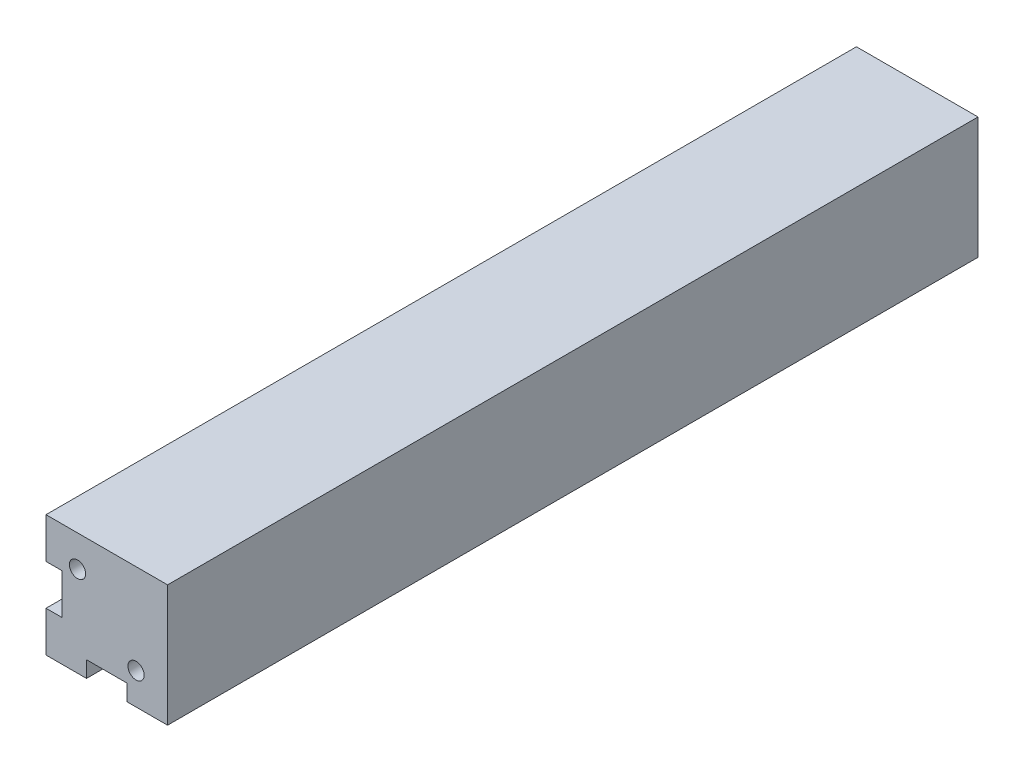
ISO-10303-21;
HEADER;
FILE_DESCRIPTION(('STEP AP214'),'2;1');
FILE_NAME('part.step','',(''),(''),'','','');
FILE_SCHEMA(('AUTOMOTIVE_DESIGN { 1 0 10303 214 1 1 1 1 }'));
ENDSEC;
DATA;
#1=APPLICATION_CONTEXT('core data for automotive mechanical design processes');
#2=APPLICATION_PROTOCOL_DEFINITION('international standard','automotive_design',2000,#1);
#3=PRODUCT_CONTEXT('',#1,'mechanical');
#4=PRODUCT('Part','Part','',(#3));
#5=PRODUCT_RELATED_PRODUCT_CATEGORY('part','',(#4));
#6=PRODUCT_DEFINITION_FORMATION('','',#4);
#7=PRODUCT_DEFINITION_CONTEXT('part definition',#1,'design');
#8=PRODUCT_DEFINITION('design','',#6,#7);
#9=PRODUCT_DEFINITION_SHAPE('','',#8);
#10=(LENGTH_UNIT() NAMED_UNIT(*) SI_UNIT(.MILLI.,.METRE.));
#11=(NAMED_UNIT(*) PLANE_ANGLE_UNIT() SI_UNIT($,.RADIAN.));
#12=(NAMED_UNIT(*) SI_UNIT($,.STERADIAN.) SOLID_ANGLE_UNIT());
#13=UNCERTAINTY_MEASURE_WITH_UNIT(LENGTH_MEASURE(1.E-05),#10,'distance_accuracy_value','');
#14=(GEOMETRIC_REPRESENTATION_CONTEXT(3) GLOBAL_UNCERTAINTY_ASSIGNED_CONTEXT((#13)) GLOBAL_UNIT_ASSIGNED_CONTEXT((#10,
#11,#12)) REPRESENTATION_CONTEXT('',''));
#15=CARTESIAN_POINT('',(0.,0.,0.));
#16=DIRECTION('',(0.,0.,1.));
#17=DIRECTION('',(1.,0.,0.));
#18=AXIS2_PLACEMENT_3D('',#15,#16,#17);
#19=CARTESIAN_POINT('',(-15.,-15.,200.));
#20=DIRECTION('',(1.,0.,0.));
#21=DIRECTION('',(0.,0.,-1.));
#22=AXIS2_PLACEMENT_3D('',#19,#20,#21);
#23=PLANE('',#22);
#24=DIRECTION('',(0.,-1.,0.));
#25=VECTOR('',#24,1.);
#26=CARTESIAN_POINT('',(-15.,-15.,200.));
#27=LINE('',#26,#25);
#28=CARTESIAN_POINT('',(-15.,-5.,200.));
#29=VERTEX_POINT('',#28);
#30=CARTESIAN_POINT('',(-15.,-15.,200.));
#31=VERTEX_POINT('',#30);
#32=EDGE_CURVE('E240',#29,#31,#27,.T.);
#33=ORIENTED_EDGE('',*,*,#32,.F.);
#34=DIRECTION('',(0.,0.,-1.));
#35=VECTOR('',#34,1.);
#36=CARTESIAN_POINT('',(-15.,-5.,200.));
#37=LINE('',#36,#35);
#38=CARTESIAN_POINT('',(-15.,-5.,0.));
#39=VERTEX_POINT('',#38);
#40=EDGE_CURVE('E196',#29,#39,#37,.T.);
#41=ORIENTED_EDGE('',*,*,#40,.T.);
#42=DIRECTION('',(0.,-1.,0.));
#43=VECTOR('',#42,1.);
#44=CARTESIAN_POINT('',(-15.,-15.,0.));
#45=LINE('',#44,#43);
#46=CARTESIAN_POINT('',(-15.,-15.,0.));
#47=VERTEX_POINT('',#46);
#48=EDGE_CURVE('E255',#39,#47,#45,.T.);
#49=ORIENTED_EDGE('',*,*,#48,.T.);
#50=DIRECTION('',(0.,0.,-1.));
#51=VECTOR('',#50,1.);
#52=CARTESIAN_POINT('',(-15.,-15.,200.));
#53=LINE('',#52,#51);
#54=EDGE_CURVE('E267',#31,#47,#53,.T.);
#55=ORIENTED_EDGE('',*,*,#54,.F.);
#56=EDGE_LOOP('',(#33,#41,#49,#55));
#57=FACE_BOUND('',#56,.T.);
#58=ADVANCED_FACE('F44',(#57),#23,.F.);
#59=CARTESIAN_POINT('',(-15.,-15.,200.));
#60=DIRECTION('',(0.,1.,0.));
#61=DIRECTION('',(0.,0.,1.));
#62=AXIS2_PLACEMENT_3D('',#59,#60,#61);
#63=PLANE('',#62);
#64=DIRECTION('',(1.,0.,0.));
#65=VECTOR('',#64,1.);
#66=CARTESIAN_POINT('',(-15.,-15.,0.));
#67=LINE('',#66,#65);
#68=CARTESIAN_POINT('',(-5.,-15.,0.));
#69=VERTEX_POINT('',#68);
#70=EDGE_CURVE('E237',#47,#69,#67,.T.);
#71=ORIENTED_EDGE('',*,*,#70,.T.);
#72=DIRECTION('',(0.,0.,1.));
#73=VECTOR('',#72,1.);
#74=CARTESIAN_POINT('',(-5.,-15.,200.));
#75=LINE('',#74,#73);
#76=CARTESIAN_POINT('',(-5.,-15.,200.));
#77=VERTEX_POINT('',#76);
#78=EDGE_CURVE('E204',#69,#77,#75,.T.);
#79=ORIENTED_EDGE('',*,*,#78,.T.);
#80=DIRECTION('',(1.,0.,0.));
#81=VECTOR('',#80,1.);
#82=CARTESIAN_POINT('',(-15.,-15.,200.));
#83=LINE('',#82,#81);
#84=EDGE_CURVE('E154',#31,#77,#83,.T.);
#85=ORIENTED_EDGE('',*,*,#84,.F.);
#86=ORIENTED_EDGE('',*,*,#54,.T.);
#87=EDGE_LOOP('',(#71,#79,#85,#86));
#88=FACE_BOUND('',#87,.T.);
#89=ADVANCED_FACE('F318',(#88),#63,.F.);
#90=CARTESIAN_POINT('',(15.,-15.,200.));
#91=DIRECTION('',(-1.,0.,0.));
#92=DIRECTION('',(0.,0.,1.));
#93=AXIS2_PLACEMENT_3D('',#90,#91,#92);
#94=PLANE('',#93);
#95=DIRECTION('',(0.,1.,0.));
#96=VECTOR('',#95,1.);
#97=CARTESIAN_POINT('',(15.,-15.,0.));
#98=LINE('',#97,#96);
#99=CARTESIAN_POINT('',(15.,-15.,0.));
#100=VERTEX_POINT('',#99);
#101=CARTESIAN_POINT('',(15.,15.,0.));
#102=VERTEX_POINT('',#101);
#103=EDGE_CURVE('E220',#100,#102,#98,.T.);
#104=ORIENTED_EDGE('',*,*,#103,.T.);
#105=DIRECTION('',(0.,0.,-1.));
#106=VECTOR('',#105,1.);
#107=CARTESIAN_POINT('',(15.,15.,200.));
#108=LINE('',#107,#106);
#109=CARTESIAN_POINT('',(15.,15.,200.));
#110=VERTEX_POINT('',#109);
#111=EDGE_CURVE('E275',#110,#102,#108,.T.);
#112=ORIENTED_EDGE('',*,*,#111,.F.);
#113=DIRECTION('',(0.,1.,0.));
#114=VECTOR('',#113,1.);
#115=CARTESIAN_POINT('',(15.,-15.,200.));
#116=LINE('',#115,#114);
#117=CARTESIAN_POINT('',(15.,-15.,200.));
#118=VERTEX_POINT('',#117);
#119=EDGE_CURVE('E232',#118,#110,#116,.T.);
#120=ORIENTED_EDGE('',*,*,#119,.F.);
#121=DIRECTION('',(0.,0.,-1.));
#122=VECTOR('',#121,1.);
#123=CARTESIAN_POINT('',(15.,-15.,200.));
#124=LINE('',#123,#122);
#125=EDGE_CURVE('E248',#118,#100,#124,.T.);
#126=ORIENTED_EDGE('',*,*,#125,.T.);
#127=EDGE_LOOP('',(#104,#112,#120,#126));
#128=FACE_BOUND('',#127,.T.);
#129=ADVANCED_FACE('F46',(#128),#94,.F.);
#130=CARTESIAN_POINT('',(-15.,15.,200.));
#131=DIRECTION('',(0.,-1.,0.));
#132=DIRECTION('',(0.,0.,-1.));
#133=AXIS2_PLACEMENT_3D('',#130,#131,#132);
#134=PLANE('',#133);
#135=DIRECTION('',(-1.,0.,0.));
#136=VECTOR('',#135,1.);
#137=CARTESIAN_POINT('',(-15.,15.,0.));
#138=LINE('',#137,#136);
#139=CARTESIAN_POINT('',(-15.,15.,0.));
#140=VERTEX_POINT('',#139);
#141=EDGE_CURVE('E252',#102,#140,#138,.T.);
#142=ORIENTED_EDGE('',*,*,#141,.T.);
#143=DIRECTION('',(0.,0.,-1.));
#144=VECTOR('',#143,1.);
#145=CARTESIAN_POINT('',(-15.,15.,200.));
#146=LINE('',#145,#144);
#147=CARTESIAN_POINT('',(-15.,15.,200.));
#148=VERTEX_POINT('',#147);
#149=EDGE_CURVE('E271',#148,#140,#146,.T.);
#150=ORIENTED_EDGE('',*,*,#149,.F.);
#151=DIRECTION('',(-1.,0.,0.));
#152=VECTOR('',#151,1.);
#153=CARTESIAN_POINT('',(-15.,15.,200.));
#154=LINE('',#153,#152);
#155=EDGE_CURVE('E236',#110,#148,#154,.T.);
#156=ORIENTED_EDGE('',*,*,#155,.F.);
#157=ORIENTED_EDGE('',*,*,#111,.T.);
#158=EDGE_LOOP('',(#142,#150,#156,#157));
#159=FACE_BOUND('',#158,.T.);
#160=ADVANCED_FACE('F313',(#159),#134,.F.);
#161=CARTESIAN_POINT('',(-15.,5.,0.));
#162=VERTEX_POINT('',#161);
#163=EDGE_CURVE('E256',#140,#162,#45,.T.);
#164=ORIENTED_EDGE('',*,*,#163,.T.);
#165=DIRECTION('',(0.,0.,1.));
#166=VECTOR('',#165,1.);
#167=CARTESIAN_POINT('',(-15.,5.,200.));
#168=LINE('',#167,#166);
#169=CARTESIAN_POINT('',(-15.,5.,200.));
#170=VERTEX_POINT('',#169);
#171=EDGE_CURVE('E67',#162,#170,#168,.T.);
#172=ORIENTED_EDGE('',*,*,#171,.T.);
#173=EDGE_CURVE('E241',#148,#170,#27,.T.);
#174=ORIENTED_EDGE('',*,*,#173,.F.);
#175=ORIENTED_EDGE('',*,*,#149,.T.);
#176=EDGE_LOOP('',(#164,#172,#174,#175));
#177=FACE_BOUND('',#176,.T.);
#178=ADVANCED_FACE('F327',(#177),#23,.F.);
#179=CARTESIAN_POINT('',(5.,-15.,200.));
#180=VERTEX_POINT('',#179);
#181=EDGE_CURVE('E245',#180,#118,#83,.T.);
#182=ORIENTED_EDGE('',*,*,#181,.F.);
#183=DIRECTION('',(0.,0.,-1.));
#184=VECTOR('',#183,1.);
#185=CARTESIAN_POINT('',(5.,-15.,200.));
#186=LINE('',#185,#184);
#187=CARTESIAN_POINT('',(5.,-15.,0.));
#188=VERTEX_POINT('',#187);
#189=EDGE_CURVE('E200',#180,#188,#186,.T.);
#190=ORIENTED_EDGE('',*,*,#189,.T.);
#191=EDGE_CURVE('E260',#188,#100,#67,.T.);
#192=ORIENTED_EDGE('',*,*,#191,.T.);
#193=ORIENTED_EDGE('',*,*,#125,.F.);
#194=EDGE_LOOP('',(#182,#190,#192,#193));
#195=FACE_BOUND('',#194,.T.);
#196=ADVANCED_FACE('F305',(#195),#63,.F.);
#197=CARTESIAN_POINT('',(0.,0.,200.));
#198=DIRECTION('',(0.,0.,-1.));
#199=DIRECTION('',(-1.,0.,0.));
#200=AXIS2_PLACEMENT_3D('',#197,#198,#199);
#201=PLANE('',#200);
#202=ORIENTED_EDGE('',*,*,#84,.T.);
#203=DIRECTION('',(0.,1.,0.));
#204=VECTOR('',#203,1.);
#205=CARTESIAN_POINT('',(-5.,-19.,200.));
#206=LINE('',#205,#204);
#207=CARTESIAN_POINT('',(-5.,-11.,200.));
#208=VERTEX_POINT('',#207);
#209=EDGE_CURVE('E134',#77,#208,#206,.T.);
#210=ORIENTED_EDGE('',*,*,#209,.T.);
#211=DIRECTION('',(1.,0.,0.));
#212=VECTOR('',#211,1.);
#213=CARTESIAN_POINT('',(5.,-11.,200.));
#214=LINE('',#213,#212);
#215=CARTESIAN_POINT('',(5.,-11.,200.));
#216=VERTEX_POINT('',#215);
#217=EDGE_CURVE('E143',#208,#216,#214,.T.);
#218=ORIENTED_EDGE('',*,*,#217,.T.);
#219=DIRECTION('',(0.,-1.,0.));
#220=VECTOR('',#219,1.);
#221=CARTESIAN_POINT('',(5.,-19.,200.));
#222=LINE('',#221,#220);
#223=EDGE_CURVE('E140',#216,#180,#222,.T.);
#224=ORIENTED_EDGE('',*,*,#223,.T.);
#225=ORIENTED_EDGE('',*,*,#181,.T.);
#226=ORIENTED_EDGE('',*,*,#119,.T.);
#227=ORIENTED_EDGE('',*,*,#155,.T.);
#228=ORIENTED_EDGE('',*,*,#173,.T.);
#229=DIRECTION('',(1.,0.,0.));
#230=VECTOR('',#229,1.);
#231=CARTESIAN_POINT('',(-11.,5.,200.));
#232=LINE('',#231,#230);
#233=CARTESIAN_POINT('',(-11.,5.,200.));
#234=VERTEX_POINT('',#233);
#235=EDGE_CURVE('E180',#170,#234,#232,.T.);
#236=ORIENTED_EDGE('',*,*,#235,.T.);
#237=DIRECTION('',(0.,-1.,0.));
#238=VECTOR('',#237,1.);
#239=CARTESIAN_POINT('',(-11.,-5.,200.));
#240=LINE('',#239,#238);
#241=CARTESIAN_POINT('',(-11.,-5.,200.));
#242=VERTEX_POINT('',#241);
#243=EDGE_CURVE('E187',#234,#242,#240,.T.);
#244=ORIENTED_EDGE('',*,*,#243,.T.);
#245=DIRECTION('',(-1.,0.,0.));
#246=VECTOR('',#245,1.);
#247=CARTESIAN_POINT('',(-11.,-5.,200.));
#248=LINE('',#247,#246);
#249=EDGE_CURVE('E173',#242,#29,#248,.T.);
#250=ORIENTED_EDGE('',*,*,#249,.T.);
#251=ORIENTED_EDGE('',*,*,#32,.T.);
#252=EDGE_LOOP('',(#202,#210,#218,#224,#225,#226,#227,#228,#236,#244,#250,#251));
#253=FACE_BOUND('',#252,.T.);
#254=CARTESIAN_POINT('',(-7.22182540694798,7.22182540694798,200.));
#255=DIRECTION('',(0.,0.,1.));
#256=DIRECTION('',(1.,0.,0.));
#257=AXIS2_PLACEMENT_3D('',#254,#255,#256);
#258=CIRCLE('',#257,2.);
#259=CARTESIAN_POINT('',(-5.22182540694798,7.22182540694798,200.));
#260=VERTEX_POINT('',#259);
#261=EDGE_CURVE('E221',#260,#260,#258,.T.);
#262=ORIENTED_EDGE('',*,*,#261,.F.);
#263=EDGE_LOOP('',(#262));
#264=FACE_BOUND('',#263,.T.);
#265=CARTESIAN_POINT('',(7.22182540694797,-7.22182540694799,200.));
#266=DIRECTION('',(0.,0.,1.));
#267=DIRECTION('',(-1.,0.,0.));
#268=AXIS2_PLACEMENT_3D('',#265,#266,#267);
#269=CIRCLE('',#268,2.00000000000001);
#270=CARTESIAN_POINT('',(5.22182540694796,-7.22182540694799,200.));
#271=VERTEX_POINT('',#270);
#272=EDGE_CURVE('E225',#271,#271,#269,.T.);
#273=ORIENTED_EDGE('',*,*,#272,.F.);
#274=EDGE_LOOP('',(#273));
#275=FACE_BOUND('',#274,.T.);
#276=ADVANCED_FACE('F151',(#253,#264,#275),#201,.F.);
#277=CARTESIAN_POINT('',(0.,0.,0.));
#278=DIRECTION('',(0.,0.,-1.));
#279=DIRECTION('',(-1.,0.,0.));
#280=AXIS2_PLACEMENT_3D('',#277,#278,#279);
#281=PLANE('',#280);
#282=DIRECTION('',(0.,1.,0.));
#283=VECTOR('',#282,1.);
#284=CARTESIAN_POINT('',(-5.,0.,0.));
#285=LINE('',#284,#283);
#286=CARTESIAN_POINT('',(-5.,-11.,0.));
#287=VERTEX_POINT('',#286);
#288=EDGE_CURVE('E11',#69,#287,#285,.T.);
#289=ORIENTED_EDGE('',*,*,#288,.F.);
#290=ORIENTED_EDGE('',*,*,#70,.F.);
#291=ORIENTED_EDGE('',*,*,#48,.F.);
#292=DIRECTION('',(-1.,0.,0.));
#293=VECTOR('',#292,1.);
#294=CARTESIAN_POINT('',(-11.,-5.,0.));
#295=LINE('',#294,#293);
#296=CARTESIAN_POINT('',(-11.,-5.,0.));
#297=VERTEX_POINT('',#296);
#298=EDGE_CURVE('E177',#297,#39,#295,.T.);
#299=ORIENTED_EDGE('',*,*,#298,.F.);
#300=DIRECTION('',(0.,-1.,0.));
#301=VECTOR('',#300,1.);
#302=CARTESIAN_POINT('',(-11.,-5.,0.));
#303=LINE('',#302,#301);
#304=CARTESIAN_POINT('',(-11.,5.,0.));
#305=VERTEX_POINT('',#304);
#306=EDGE_CURVE('E165',#305,#297,#303,.T.);
#307=ORIENTED_EDGE('',*,*,#306,.F.);
#308=DIRECTION('',(1.,0.,0.));
#309=VECTOR('',#308,1.);
#310=CARTESIAN_POINT('',(0.,5.,0.));
#311=LINE('',#310,#309);
#312=EDGE_CURVE('E53',#162,#305,#311,.T.);
#313=ORIENTED_EDGE('',*,*,#312,.F.);
#314=ORIENTED_EDGE('',*,*,#163,.F.);
#315=ORIENTED_EDGE('',*,*,#141,.F.);
#316=ORIENTED_EDGE('',*,*,#103,.F.);
#317=ORIENTED_EDGE('',*,*,#191,.F.);
#318=DIRECTION('',(0.,-1.,0.));
#319=VECTOR('',#318,1.);
#320=CARTESIAN_POINT('',(5.,-19.,0.));
#321=LINE('',#320,#319);
#322=CARTESIAN_POINT('',(5.,-11.,0.));
#323=VERTEX_POINT('',#322);
#324=EDGE_CURVE('E156',#323,#188,#321,.T.);
#325=ORIENTED_EDGE('',*,*,#324,.F.);
#326=DIRECTION('',(1.,0.,0.));
#327=VECTOR('',#326,1.);
#328=CARTESIAN_POINT('',(5.,-11.,0.));
#329=LINE('',#328,#327);
#330=EDGE_CURVE('E159',#287,#323,#329,.T.);
#331=ORIENTED_EDGE('',*,*,#330,.F.);
#332=EDGE_LOOP('',(#289,#290,#291,#299,#307,#313,#314,#315,#316,#317,#325,#331));
#333=FACE_BOUND('',#332,.T.);
#334=CARTESIAN_POINT('',(0.,0.,0.));
#335=DIRECTION('',(0.,0.,-1.));
#336=DIRECTION('',(-1.,0.,0.));
#337=AXIS2_PLACEMENT_3D('',#334,#335,#336);
#338=CIRCLE('',#337,2.);
#339=CARTESIAN_POINT('',(-2.,0.,0.));
#340=VERTEX_POINT('',#339);
#341=EDGE_CURVE('E207',#340,#340,#338,.T.);
#342=ORIENTED_EDGE('',*,*,#341,.F.);
#343=EDGE_LOOP('',(#342));
#344=FACE_BOUND('',#343,.T.);
#345=ADVANCED_FACE('F287',(#333,#344),#281,.T.);
#346=CARTESIAN_POINT('',(7.22182540694797,-7.22182540694799,175.));
#347=DIRECTION('',(0.,0.,1.));
#348=DIRECTION('',(1.,0.,0.));
#349=AXIS2_PLACEMENT_3D('',#346,#347,#348);
#350=CYLINDRICAL_SURFACE('',#349,2.00000000000001);
#351=CARTESIAN_POINT('',(7.22182540694797,-7.22182540694799,175.));
#352=DIRECTION('',(0.,0.,1.));
#353=DIRECTION('',(-1.,0.,0.));
#354=AXIS2_PLACEMENT_3D('',#351,#352,#353);
#355=CIRCLE('',#354,2.00000000000001);
#356=CARTESIAN_POINT('',(5.22182540694796,-7.22182540694799,175.));
#357=VERTEX_POINT('',#356);
#358=EDGE_CURVE('E212',#357,#357,#355,.T.);
#359=ORIENTED_EDGE('',*,*,#358,.F.);
#360=EDGE_LOOP('',(#359));
#361=FACE_BOUND('',#360,.T.);
#362=ORIENTED_EDGE('',*,*,#272,.T.);
#363=EDGE_LOOP('',(#362));
#364=FACE_BOUND('',#363,.T.);
#365=ADVANCED_FACE('F346',(#361,#364),#350,.F.);
#366=CARTESIAN_POINT('',(7.22182540694797,-7.22182540694799,175.));
#367=DIRECTION('',(0.,0.,-1.));
#368=DIRECTION('',(-1.,0.,0.));
#369=AXIS2_PLACEMENT_3D('',#366,#367,#368);
#370=PLANE('',#369);
#371=ORIENTED_EDGE('',*,*,#358,.T.);
#372=EDGE_LOOP('',(#371));
#373=FACE_BOUND('',#372,.T.);
#374=ADVANCED_FACE('F350',(#373),#370,.F.);
#375=CARTESIAN_POINT('',(-7.22182540694798,7.22182540694798,175.));
#376=DIRECTION('',(0.,0.,1.));
#377=DIRECTION('',(1.,0.,0.));
#378=AXIS2_PLACEMENT_3D('',#375,#376,#377);
#379=CYLINDRICAL_SURFACE('',#378,2.);
#380=CARTESIAN_POINT('',(-7.22182540694798,7.22182540694798,175.));
#381=DIRECTION('',(0.,0.,1.));
#382=DIRECTION('',(1.,0.,0.));
#383=AXIS2_PLACEMENT_3D('',#380,#381,#382);
#384=CIRCLE('',#383,2.);
#385=CARTESIAN_POINT('',(-5.22182540694798,7.22182540694798,175.));
#386=VERTEX_POINT('',#385);
#387=EDGE_CURVE('E216',#386,#386,#384,.T.);
#388=ORIENTED_EDGE('',*,*,#387,.F.);
#389=EDGE_LOOP('',(#388));
#390=FACE_BOUND('',#389,.T.);
#391=ORIENTED_EDGE('',*,*,#261,.T.);
#392=EDGE_LOOP('',(#391));
#393=FACE_BOUND('',#392,.T.);
#394=ADVANCED_FACE('F360',(#390,#393),#379,.F.);
#395=CARTESIAN_POINT('',(-7.22182540694798,7.22182540694798,175.));
#396=DIRECTION('',(0.,0.,1.));
#397=DIRECTION('',(1.,0.,0.));
#398=AXIS2_PLACEMENT_3D('',#395,#396,#397);
#399=PLANE('',#398);
#400=ORIENTED_EDGE('',*,*,#387,.T.);
#401=EDGE_LOOP('',(#400));
#402=FACE_BOUND('',#401,.T.);
#403=ADVANCED_FACE('F369',(#402),#399,.T.);
#404=CARTESIAN_POINT('',(0.,0.,25.));
#405=DIRECTION('',(0.,0.,-1.));
#406=DIRECTION('',(-1.,0.,0.));
#407=AXIS2_PLACEMENT_3D('',#404,#405,#406);
#408=CYLINDRICAL_SURFACE('',#407,2.);
#409=CARTESIAN_POINT('',(0.,0.,25.));
#410=DIRECTION('',(0.,0.,-1.));
#411=DIRECTION('',(-1.,0.,0.));
#412=AXIS2_PLACEMENT_3D('',#409,#410,#411);
#413=CIRCLE('',#412,2.);
#414=CARTESIAN_POINT('',(-2.,0.,25.));
#415=VERTEX_POINT('',#414);
#416=EDGE_CURVE('E208',#415,#415,#413,.T.);
#417=ORIENTED_EDGE('',*,*,#416,.F.);
#418=EDGE_LOOP('',(#417));
#419=FACE_BOUND('',#418,.T.);
#420=ORIENTED_EDGE('',*,*,#341,.T.);
#421=EDGE_LOOP('',(#420));
#422=FACE_BOUND('',#421,.T.);
#423=ADVANCED_FACE('F378',(#419,#422),#408,.F.);
#424=CARTESIAN_POINT('',(0.,0.,25.));
#425=DIRECTION('',(0.,0.,-1.));
#426=DIRECTION('',(-1.,0.,0.));
#427=AXIS2_PLACEMENT_3D('',#424,#425,#426);
#428=PLANE('',#427);
#429=ORIENTED_EDGE('',*,*,#416,.T.);
#430=EDGE_LOOP('',(#429));
#431=FACE_BOUND('',#430,.T.);
#432=ADVANCED_FACE('F387',(#431),#428,.T.);
#433=CARTESIAN_POINT('',(-11.,-5.,200.));
#434=DIRECTION('',(0.,-1.,0.));
#435=DIRECTION('',(0.,0.,-1.));
#436=AXIS2_PLACEMENT_3D('',#433,#434,#435);
#437=PLANE('',#436);
#438=ORIENTED_EDGE('',*,*,#249,.F.);
#439=DIRECTION('',(0.,0.,-1.));
#440=VECTOR('',#439,1.);
#441=CARTESIAN_POINT('',(-11.,-5.,200.));
#442=LINE('',#441,#440);
#443=EDGE_CURVE('E174',#242,#297,#442,.T.);
#444=ORIENTED_EDGE('',*,*,#443,.T.);
#445=ORIENTED_EDGE('',*,*,#298,.T.);
#446=ORIENTED_EDGE('',*,*,#40,.F.);
#447=EDGE_LOOP('',(#438,#444,#445,#446));
#448=FACE_BOUND('',#447,.T.);
#449=ADVANCED_FACE('F293',(#448),#437,.F.);
#450=CARTESIAN_POINT('',(-11.,5.,200.));
#451=DIRECTION('',(0.,1.,0.));
#452=DIRECTION('',(0.,0.,1.));
#453=AXIS2_PLACEMENT_3D('',#450,#451,#452);
#454=PLANE('',#453);
#455=ORIENTED_EDGE('',*,*,#312,.T.);
#456=DIRECTION('',(0.,0.,-1.));
#457=VECTOR('',#456,1.);
#458=CARTESIAN_POINT('',(-11.,5.,200.));
#459=LINE('',#458,#457);
#460=EDGE_CURVE('E169',#234,#305,#459,.T.);
#461=ORIENTED_EDGE('',*,*,#460,.F.);
#462=ORIENTED_EDGE('',*,*,#235,.F.);
#463=ORIENTED_EDGE('',*,*,#171,.F.);
#464=EDGE_LOOP('',(#455,#461,#462,#463));
#465=FACE_BOUND('',#464,.T.);
#466=ADVANCED_FACE('F279',(#465),#454,.F.);
#467=CARTESIAN_POINT('',(-11.,-5.,200.));
#468=DIRECTION('',(1.,0.,0.));
#469=DIRECTION('',(0.,0.,-1.));
#470=AXIS2_PLACEMENT_3D('',#467,#468,#469);
#471=PLANE('',#470);
#472=ORIENTED_EDGE('',*,*,#306,.T.);
#473=ORIENTED_EDGE('',*,*,#443,.F.);
#474=ORIENTED_EDGE('',*,*,#243,.F.);
#475=ORIENTED_EDGE('',*,*,#460,.T.);
#476=EDGE_LOOP('',(#472,#473,#474,#475));
#477=FACE_BOUND('',#476,.T.);
#478=ADVANCED_FACE('F285',(#477),#471,.F.);
#479=CARTESIAN_POINT('',(-5.,-19.,200.));
#480=DIRECTION('',(-1.,0.,0.));
#481=DIRECTION('',(0.,0.,1.));
#482=AXIS2_PLACEMENT_3D('',#479,#480,#481);
#483=PLANE('',#482);
#484=ORIENTED_EDGE('',*,*,#288,.T.);
#485=DIRECTION('',(0.,0.,-1.));
#486=VECTOR('',#485,1.);
#487=CARTESIAN_POINT('',(-5.,-11.,200.));
#488=LINE('',#487,#486);
#489=EDGE_CURVE('E60',#208,#287,#488,.T.);
#490=ORIENTED_EDGE('',*,*,#489,.F.);
#491=ORIENTED_EDGE('',*,*,#209,.F.);
#492=ORIENTED_EDGE('',*,*,#78,.F.);
#493=EDGE_LOOP('',(#484,#490,#491,#492));
#494=FACE_BOUND('',#493,.T.);
#495=ADVANCED_FACE('F132',(#494),#483,.F.);
#496=CARTESIAN_POINT('',(5.,-19.,200.));
#497=DIRECTION('',(1.,0.,0.));
#498=DIRECTION('',(0.,0.,-1.));
#499=AXIS2_PLACEMENT_3D('',#496,#497,#498);
#500=PLANE('',#499);
#501=ORIENTED_EDGE('',*,*,#223,.F.);
#502=DIRECTION('',(0.,0.,-1.));
#503=VECTOR('',#502,1.);
#504=CARTESIAN_POINT('',(5.,-11.,200.));
#505=LINE('',#504,#503);
#506=EDGE_CURVE('E139',#216,#323,#505,.T.);
#507=ORIENTED_EDGE('',*,*,#506,.T.);
#508=ORIENTED_EDGE('',*,*,#324,.T.);
#509=ORIENTED_EDGE('',*,*,#189,.F.);
#510=EDGE_LOOP('',(#501,#507,#508,#509));
#511=FACE_BOUND('',#510,.T.);
#512=ADVANCED_FACE('F316',(#511),#500,.F.);
#513=CARTESIAN_POINT('',(5.,-11.,200.));
#514=DIRECTION('',(0.,1.,0.));
#515=DIRECTION('',(0.,0.,1.));
#516=AXIS2_PLACEMENT_3D('',#513,#514,#515);
#517=PLANE('',#516);
#518=ORIENTED_EDGE('',*,*,#330,.T.);
#519=ORIENTED_EDGE('',*,*,#506,.F.);
#520=ORIENTED_EDGE('',*,*,#217,.F.);
#521=ORIENTED_EDGE('',*,*,#489,.T.);
#522=EDGE_LOOP('',(#518,#519,#520,#521));
#523=FACE_BOUND('',#522,.T.);
#524=ADVANCED_FACE('F144',(#523),#517,.F.);
#525=CLOSED_SHELL('',(#58,#89,#129,#160,#178,#196,#276,#345,#365,#374,#394,#403,#423,#432,#449,
#466,#478,#495,#512,#524));
#526=MANIFOLD_SOLID_BREP('B2',#525);
#527=ADVANCED_BREP_SHAPE_REPRESENTATION('',(#18,#526),#14);
#528=SHAPE_DEFINITION_REPRESENTATION(#9,#527);
ENDSEC;
END-ISO-10303-21;
